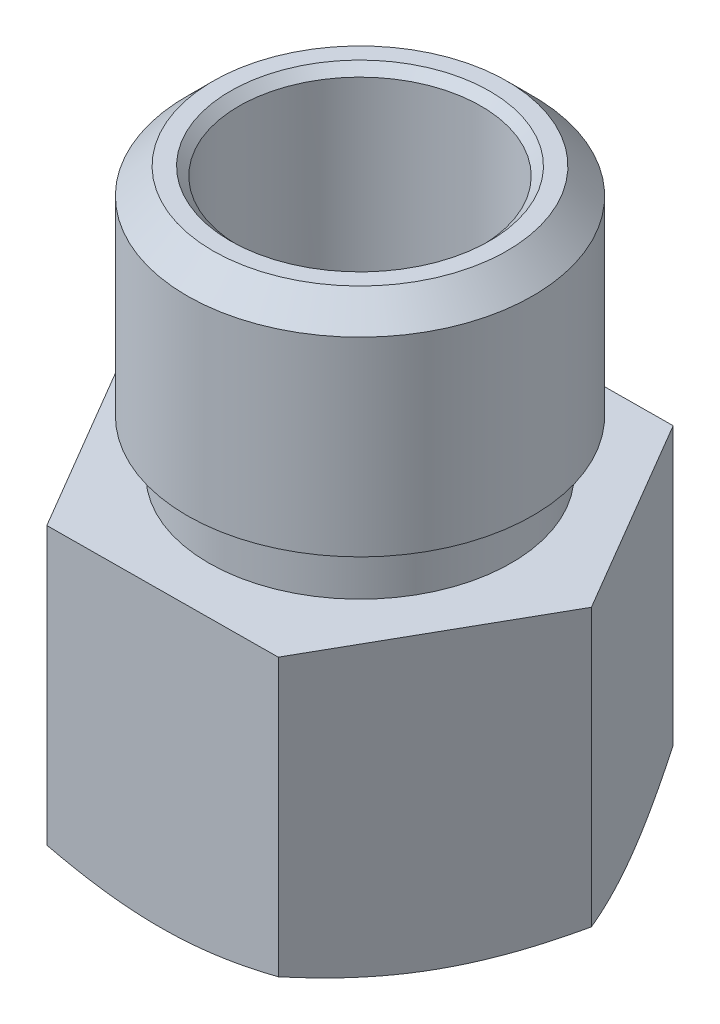
ISO-10303-21;
HEADER;
FILE_DESCRIPTION(('STEP AP214'),'2;1');
FILE_NAME('part.step','',(''),(''),'','','');
FILE_SCHEMA(('AUTOMOTIVE_DESIGN { 1 0 10303 214 1 1 1 1 }'));
ENDSEC;
DATA;
#1=APPLICATION_CONTEXT('core data for automotive mechanical design processes');
#2=APPLICATION_PROTOCOL_DEFINITION('international standard','automotive_design',2000,#1);
#3=PRODUCT_CONTEXT('',#1,'mechanical');
#4=PRODUCT('Part','Part','',(#3));
#5=PRODUCT_RELATED_PRODUCT_CATEGORY('part','',(#4));
#6=PRODUCT_DEFINITION_FORMATION('','',#4);
#7=PRODUCT_DEFINITION_CONTEXT('part definition',#1,'design');
#8=PRODUCT_DEFINITION('design','',#6,#7);
#9=PRODUCT_DEFINITION_SHAPE('','',#8);
#10=(LENGTH_UNIT() NAMED_UNIT(*) SI_UNIT(.MILLI.,.METRE.));
#11=(NAMED_UNIT(*) PLANE_ANGLE_UNIT() SI_UNIT($,.RADIAN.));
#12=(NAMED_UNIT(*) SI_UNIT($,.STERADIAN.) SOLID_ANGLE_UNIT());
#13=UNCERTAINTY_MEASURE_WITH_UNIT(LENGTH_MEASURE(1.E-05),#10,'distance_accuracy_value','');
#14=(GEOMETRIC_REPRESENTATION_CONTEXT(3) GLOBAL_UNCERTAINTY_ASSIGNED_CONTEXT((#13)) GLOBAL_UNIT_ASSIGNED_CONTEXT((#10,
#11,#12)) REPRESENTATION_CONTEXT('',''));
#15=CARTESIAN_POINT('',(0.,0.,0.));
#16=DIRECTION('',(0.,0.,1.));
#17=DIRECTION('',(1.,0.,0.));
#18=AXIS2_PLACEMENT_3D('',#15,#16,#17);
#19=CARTESIAN_POINT('',(0.,0.,0.));
#20=DIRECTION('',(0.,1.,0.));
#21=DIRECTION('',(0.,0.,1.));
#22=AXIS2_PLACEMENT_3D('',#19,#20,#21);
#23=CYLINDRICAL_SURFACE('',#22,7.);
#24=CARTESIAN_POINT('',(0.,32.,0.));
#25=DIRECTION('',(0.,1.,0.));
#26=DIRECTION('',(0.,0.,1.));
#27=AXIS2_PLACEMENT_3D('',#24,#25,#26);
#28=CIRCLE('',#27,7.);
#29=CARTESIAN_POINT('',(0.,32.,7.));
#30=VERTEX_POINT('',#29);
#31=EDGE_CURVE('E46',#30,#30,#28,.T.);
#32=ORIENTED_EDGE('',*,*,#31,.T.);
#33=EDGE_LOOP('',(#32));
#34=FACE_BOUND('',#33,.T.);
#35=CARTESIAN_POINT('',(0.,13.,0.));
#36=DIRECTION('',(0.,-1.,0.));
#37=DIRECTION('',(0.,0.,-1.));
#38=AXIS2_PLACEMENT_3D('',#35,#36,#37);
#39=CIRCLE('',#38,7.);
#40=CARTESIAN_POINT('',(0.,13.,-7.));
#41=VERTEX_POINT('',#40);
#42=EDGE_CURVE('E41',#41,#41,#39,.F.);
#43=ORIENTED_EDGE('',*,*,#42,.F.);
#44=EDGE_LOOP('',(#43));
#45=FACE_BOUND('',#44,.T.);
#46=ADVANCED_FACE('F37',(#34,#45),#23,.F.);
#47=CARTESIAN_POINT('',(13.2786844152626,17.,-0.0993656540089263));
#48=DIRECTION('',(-0.862259714880802,0.,0.506466370150751));
#49=DIRECTION('',(0.506466370150751,0.,0.862259714880802));
#50=AXIS2_PLACEMENT_3D('',#47,#48,#49);
#51=PLANE('',#50);
#52=DIRECTION('',(0.,-1.,0.));
#53=VECTOR('',#52,1.);
#54=CARTESIAN_POINT('',(13.2786844152626,17.,-0.0993656540089263));
#55=LINE('',#54,#53);
#56=CARTESIAN_POINT('',(13.2786844152626,17.,-0.0993656540089263));
#57=VERTEX_POINT('',#56);
#58=CARTESIAN_POINT('',(13.2786844152626,0.999999999999913,-0.0993656540089263));
#59=VERTEX_POINT('',#58);
#60=EDGE_CURVE('E105',#57,#59,#55,.T.);
#61=ORIENTED_EDGE('',*,*,#60,.T.);
#62=CARTESIAN_POINT('',(13.278801889467,1.00005798792879,-0.0991656540089266));
#63=CARTESIAN_POINT('',(13.0892477828478,0.906495480012444,-0.421881789888406));
#64=CARTESIAN_POINT('',(12.8989551950581,0.818485549010916,-0.745855191010019));
#65=CARTESIAN_POINT('',(12.5168543572176,0.655424160118906,-1.39638241040671));
#66=CARTESIAN_POINT('',(12.3250453794867,0.580379375303605,-1.72293746755796));
#67=CARTESIAN_POINT('',(11.9397828409977,0.445101486414631,-2.37884748680155));
#68=CARTESIAN_POINT('',(11.7463272663629,0.384890468454874,-2.70820587752167));
#69=CARTESIAN_POINT('',(11.3582872115426,0.281279927851655,-3.36884462226612));
#70=CARTESIAN_POINT('',(11.1637029318079,0.237877507605416,-3.70012463502266));
#71=CARTESIAN_POINT('',(10.7781213489979,0.170174920080449,-4.35657782767609));
#72=CARTESIAN_POINT('',(10.5871427365605,0.145463994403388,-4.68171918673529));
#73=CARTESIAN_POINT('',(10.2047880025491,0.114463177060262,-5.33267866472373));
#74=CARTESIAN_POINT('',(10.0134118618347,0.108174193966666,-5.65849681623943));
#75=CARTESIAN_POINT('',(9.6309432470842,0.114261147632678,-6.30965017634794));
#76=CARTESIAN_POINT('',(9.43985068958976,0.126616979719078,-6.63498552702868));
#77=CARTESIAN_POINT('',(9.05821021566678,0.169480274015968,-7.28472897620153));
#78=CARTESIAN_POINT('',(8.86766225419606,0.199986188699251,-7.60913715137802));
#79=CARTESIAN_POINT('',(8.49944267573429,0.275586286577359,-8.23603150695678));
#80=CARTESIAN_POINT('',(8.32171553673145,0.319641320413002,-8.53861221366305));
#81=CARTESIAN_POINT('',(7.96725959631279,0.421466529051991,-9.14207395591501));
#82=CARTESIAN_POINT('',(7.7905309034253,0.479238166525155,-9.44295480669108));
#83=CARTESIAN_POINT('',(7.43626366329683,0.607771425592251,-10.0460952864308));
#84=CARTESIAN_POINT('',(7.25873805796857,0.67867070482349,-10.3483328817698));
#85=CARTESIAN_POINT('',(6.90498939101579,0.831480584190287,-10.950590489941));
#86=CARTESIAN_POINT('',(6.72876576088822,0.913386036987412,-11.2506114706506));
#87=CARTESIAN_POINT('',(6.55317155279144,1.00005798792881,-11.5495608594584));
#88=B_SPLINE_CURVE_WITH_KNOTS('',3,(#62,#63,#64,#65,#66,#67,#68,#69,#70,#71,#72,#73,#74,#75,#76,
#77,#78,#79,#80,#81,#82,#83,#84,#85,#86,#87),.UNSPECIFIED.,.F.,.F.,(4,2,2,2,2,2,2,2,2,2,2,2,4),
(0.,1.15741546007654,2.31542487092911,3.47514817024263,4.63467145793502,5.76790726441043,
6.901198961274,8.03326950451839,9.16524353806669,10.2259639835277,11.2867975897379,
12.3594596383154,13.4316217618208),.UNSPECIFIED.);
#89=CARTESIAN_POINT('',(6.55328902699588,0.999999999999936,-11.5493608594584));
#90=VERTEX_POINT('',#89);
#91=EDGE_CURVE('E53',#59,#90,#88,.T.);
#92=ORIENTED_EDGE('',*,*,#91,.T.);
#93=DIRECTION('',(0.,-1.,0.));
#94=VECTOR('',#93,1.);
#95=CARTESIAN_POINT('',(6.55328902699589,17.,-11.5493608594584));
#96=LINE('',#95,#94);
#97=CARTESIAN_POINT('',(6.55328902699589,17.,-11.5493608594584));
#98=VERTEX_POINT('',#97);
#99=EDGE_CURVE('E104',#98,#90,#96,.T.);
#100=ORIENTED_EDGE('',*,*,#99,.F.);
#101=DIRECTION('',(-0.506466370150751,0.,-0.862259714880802));
#102=VECTOR('',#101,1.);
#103=CARTESIAN_POINT('',(13.2786844152626,17.,-0.0993656540089263));
#104=LINE('',#103,#102);
#105=EDGE_CURVE('E266',#57,#98,#104,.T.);
#106=ORIENTED_EDGE('',*,*,#105,.F.);
#107=EDGE_LOOP('',(#61,#92,#100,#106));
#108=FACE_BOUND('',#107,.T.);
#109=ADVANCED_FACE('F102',(#108),#51,.F.);
#110=CARTESIAN_POINT('',(6.55328902699589,17.,-11.5493608594584));
#111=DIRECTION('',(0.00748288527264228,0.,0.999972002822077));
#112=DIRECTION('',(0.999972002822077,0.,-0.00748288527264228));
#113=AXIS2_PLACEMENT_3D('',#110,#111,#112);
#114=PLANE('',#113);
#115=ORIENTED_EDGE('',*,*,#99,.T.);
#116=CARTESIAN_POINT('',(6.55348902699589,1.00005000196466,-11.5493623560773));
#117=CARTESIAN_POINT('',(6.17923229772127,0.906488004955447,-11.5465617575008));
#118=CARTESIAN_POINT('',(5.80351750874437,0.818478587991021,-11.5437502481253));
#119=CARTESIAN_POINT('',(5.04909540759903,0.655418223151411,-11.5381048360397));
#120=CARTESIAN_POINT('',(4.67038665870723,0.580373948311718,-11.5352709225784));
#121=CARTESIAN_POINT('',(3.90972211150778,0.445097066884958,-11.5295787976773));
#122=CARTESIAN_POINT('',(3.52776233709572,0.384886545907937,-11.5267205564839));
#123=CARTESIAN_POINT('',(2.76161388734343,0.281276966483241,-11.5209873950203));
#124=CARTESIAN_POINT('',(2.37742560777006,0.237875010449097,-11.5181124777116));
#125=CARTESIAN_POINT('',(1.61613116407676,0.170173285486741,-11.5124156392353));
#126=CARTESIAN_POINT('',(1.23906190221761,0.145462761642441,-11.5095939942109));
#127=CARTESIAN_POINT('',(0.484138552019265,0.114462686189678,-11.5039448312311));
#128=CARTESIAN_POINT('',(0.106284425889888,0.108174043157357,-11.5011173129929));
#129=CARTESIAN_POINT('',(-0.648863742889136,0.114261600739779,-11.4954664676744));
#130=CARTESIAN_POINT('',(-1.02615795033378,0.126617696996423,-11.4926431393608));
#131=CARTESIAN_POINT('',(-1.77967101273376,0.16948143639026,-11.4870045296983));
#132=CARTESIAN_POINT('',(-2.15588995662197,0.199987531999137,-11.4841892476838));
#133=CARTESIAN_POINT('',(-2.88290153838933,0.275587568352364,-11.4787489511126));
#134=CARTESIAN_POINT('',(-3.23380381381667,0.319642229755087,-11.4761231161277));
#135=CARTESIAN_POINT('',(-3.93363727744409,0.421466387743175,-11.4708861959905));
#136=CARTESIAN_POINT('',(-4.28256825138991,0.47923734682663,-11.4682751124414));
#137=CARTESIAN_POINT('',(-4.98202913527991,0.607768971979281,-11.4630409803536));
#138=CARTESIAN_POINT('',(-5.33253349355472,0.678667290738526,-11.4604181230205));
#139=CARTESIAN_POINT('',(-6.03097051886239,0.831475033525346,-11.4551916525635));
#140=CARTESIAN_POINT('',(-6.37890430827846,0.913379310541671,-11.4525880310408));
#141=CARTESIAN_POINT('',(-6.72559538826666,1.00005000196464,-11.4499937088305));
#142=B_SPLINE_CURVE_WITH_KNOTS('',3,(#116,#117,#118,#119,#120,#121,#122,#123,#124,#125,#126,
#127,#128,#129,#130,#131,#132,#133,#134,#135,#136,#137,#138,#139,#140,#141),.UNSPECIFIED.,.F.,
.F.,(4,2,2,2,2,2,2,2,2,2,2,2,4),(0.,1.15741306233225,2.31542007088461,3.47514092704066,
4.63466177273383,5.76789534332623,6.90118480460978,8.03325312886427,9.16522494310022,
10.225933731874,11.2867556693873,12.3594057431476,13.4315559193472),.UNSPECIFIED.);
#143=CARTESIAN_POINT('',(-6.72539538826666,0.999999999999913,-11.4499952054494));
#144=VERTEX_POINT('',#143);
#145=EDGE_CURVE('E90',#90,#144,#142,.T.);
#146=ORIENTED_EDGE('',*,*,#145,.T.);
#147=DIRECTION('',(0.,-1.,0.));
#148=VECTOR('',#147,1.);
#149=CARTESIAN_POINT('',(-6.72539538826666,17.,-11.4499952054494));
#150=LINE('',#149,#148);
#151=CARTESIAN_POINT('',(-6.72539538826666,17.,-11.4499952054494));
#152=VERTEX_POINT('',#151);
#153=EDGE_CURVE('E111',#152,#144,#150,.T.);
#154=ORIENTED_EDGE('',*,*,#153,.F.);
#155=DIRECTION('',(-0.999972002822077,0.,0.00748288527264229));
#156=VECTOR('',#155,1.);
#157=CARTESIAN_POINT('',(6.55328902699589,17.,-11.5493608594584));
#158=LINE('',#157,#156);
#159=EDGE_CURVE('E109',#98,#152,#158,.T.);
#160=ORIENTED_EDGE('',*,*,#159,.F.);
#161=EDGE_LOOP('',(#115,#146,#154,#160));
#162=FACE_BOUND('',#161,.T.);
#163=ADVANCED_FACE('F108',(#162),#114,.F.);
#164=CARTESIAN_POINT('',(-6.72539538826666,17.,-11.4499952054494));
#165=DIRECTION('',(0.869742600153445,0.,0.493505632671326));
#166=DIRECTION('',(0.493505632671326,0.,-0.869742600153445));
#167=AXIS2_PLACEMENT_3D('',#164,#165,#166);
#168=PLANE('',#167);
#169=ORIENTED_EDGE('',*,*,#153,.T.);
#170=CARTESIAN_POINT('',(-6.72528190512059,1.00005748901951,-11.4501952054494));
#171=CARTESIAN_POINT('',(-6.90998520223733,0.906495013021198,-11.1246785036001));
#172=CARTESIAN_POINT('',(-7.0954080822684,0.818485114133238,-10.7978936259216));
#173=CARTESIAN_POINT('',(-7.46773071755255,0.655423789217099,-10.1417210607673));
#174=CARTESIAN_POINT('',(-7.65463118186342,0.580379036261622,-9.81233212366499));
#175=CARTESIAN_POINT('',(-8.0300346068258,0.445101210312064,-9.15073004798871));
#176=CARTESIAN_POINT('',(-8.21853952981428,0.38489022340042,-8.81851345103871));
#177=CARTESIAN_POINT('',(-8.59664939141831,0.281279742845112,-8.15214161573655));
#178=CARTESIAN_POINT('',(-8.78625413471284,0.237877351599688,-7.81798672161351));
#179=CARTESIAN_POINT('',(-9.16196843863417,0.170174817961752,-7.15583676024718));
#180=CARTESIAN_POINT('',(-9.34805978694809,0.145463917388455,-6.82787378995135));
#181=CARTESIAN_POINT('',(-9.72062981965142,0.11446314639355,-6.17126521746428));
#182=CARTESIAN_POINT('',(-9.90710852269132,0.108174184544642,-5.84261958240386));
#183=CARTESIAN_POINT('',(-10.2797895209837,0.114261175939173,-5.18581544679942));
#184=CARTESIAN_POINT('',(-10.4659918975592,0.12661702452909,-4.85765680293364));
#185=CARTESIAN_POINT('',(-10.8378659470453,0.169480346632508,-4.20227481473041));
#186=CARTESIAN_POINT('',(-11.0235376638455,0.199986272618733,-3.87505139304303));
#187=CARTESIAN_POINT('',(-11.3823341688252,0.275586366653234,-3.24271695852426));
#188=CARTESIAN_POINT('',(-11.5555130586223,0.31964137722188,-2.93751059828783));
#189=CARTESIAN_POINT('',(-11.9008980498391,0.421466520223447,-2.32881229693535));
#190=CARTESIAN_POINT('',(-12.0731040455087,0.479238115315459,-2.02532054219103));
#191=CARTESIAN_POINT('',(-12.4183051651242,0.607771272306697,-1.41694629177955));
#192=CARTESIAN_POINT('',(-12.5912876783775,0.678670491534158,-1.11208602089748));
#193=CARTESIAN_POINT('',(-12.9359834959049,0.831480237421918,-0.504602302878869));
#194=CARTESIAN_POINT('',(-13.1076973541314,0.913385616764225,-0.201977879469661));
#195=CARTESIAN_POINT('',(-13.2787978984086,1.00005748901945,0.0995656540089272));
#196=B_SPLINE_CURVE_WITH_KNOTS('',3,(#170,#171,#172,#173,#174,#175,#176,#177,#178,#179,#180,
#181,#182,#183,#184,#185,#186,#187,#188,#189,#190,#191,#192,#193,#194,#195),.UNSPECIFIED.,.F.,
.F.,(4,2,2,2,2,2,2,2,2,2,2,2,4),(0.,1.15741531028125,2.31542457105391,3.47514771773503,
4.63467085286736,5.76790651965949,6.90119807685872,8.03326848147521,9.16524237637546,
10.2259620936075,11.2867949708385,12.3594562713123,13.4316176484328),.UNSPECIFIED.);
#197=CARTESIAN_POINT('',(-13.2786844152626,0.999999999999867,0.0993656540089118));
#198=VERTEX_POINT('',#197);
#199=EDGE_CURVE('E93',#144,#198,#196,.T.);
#200=ORIENTED_EDGE('',*,*,#199,.T.);
#201=DIRECTION('',(0.,-1.,0.));
#202=VECTOR('',#201,1.);
#203=CARTESIAN_POINT('',(-13.2786844152625,17.,0.0993656540089282));
#204=LINE('',#203,#202);
#205=CARTESIAN_POINT('',(-13.2786844152625,17.,0.0993656540089282));
#206=VERTEX_POINT('',#205);
#207=EDGE_CURVE('E116',#206,#198,#204,.T.);
#208=ORIENTED_EDGE('',*,*,#207,.F.);
#209=DIRECTION('',(-0.493505632671326,0.,0.869742600153444));
#210=VECTOR('',#209,1.);
#211=CARTESIAN_POINT('',(-6.72539538826666,17.,-11.4499952054494));
#212=LINE('',#211,#210);
#213=EDGE_CURVE('E263',#152,#206,#212,.T.);
#214=ORIENTED_EDGE('',*,*,#213,.F.);
#215=EDGE_LOOP('',(#169,#200,#208,#214));
#216=FACE_BOUND('',#215,.T.);
#217=ADVANCED_FACE('F195',(#216),#168,.F.);
#218=CARTESIAN_POINT('',(-13.2786844152625,17.,0.0993656540089282));
#219=DIRECTION('',(0.862259714880802,0.,-0.506466370150751));
#220=DIRECTION('',(-0.506466370150751,0.,-0.862259714880802));
#221=AXIS2_PLACEMENT_3D('',#218,#219,#220);
#222=PLANE('',#221);
#223=ORIENTED_EDGE('',*,*,#207,.T.);
#224=CARTESIAN_POINT('',(-13.278801889467,1.00005798792873,0.0991656540089284));
#225=CARTESIAN_POINT('',(-13.0892477828478,0.906495480012392,0.421881789888409));
#226=CARTESIAN_POINT('',(-12.8989551950581,0.818485549010863,0.745855191010022));
#227=CARTESIAN_POINT('',(-12.5168543572176,0.655424160118849,1.39638241040671));
#228=CARTESIAN_POINT('',(-12.3250453794867,0.580379375303546,1.72293746755796));
#229=CARTESIAN_POINT('',(-11.9397828409977,0.44510148641457,2.37884748680155));
#230=CARTESIAN_POINT('',(-11.7463272663629,0.384890468454813,2.70820587752167));
#231=CARTESIAN_POINT('',(-11.3582872115426,0.281279927851592,3.36884462226613));
#232=CARTESIAN_POINT('',(-11.1637029318079,0.237877507605351,3.70012463502267));
#233=CARTESIAN_POINT('',(-10.7781213489979,0.170174920080382,4.3565778276761));
#234=CARTESIAN_POINT('',(-10.5871427365605,0.14546399440332,4.6817191867353));
#235=CARTESIAN_POINT('',(-10.2047880025491,0.114463177060191,5.33267866472375));
#236=CARTESIAN_POINT('',(-10.0134118618347,0.108174193966594,5.65849681623944));
#237=CARTESIAN_POINT('',(-9.63094324708419,0.114261147632604,6.30965017634795));
#238=CARTESIAN_POINT('',(-9.43985068958975,0.126616979719004,6.6349855270287));
#239=CARTESIAN_POINT('',(-9.05821021566677,0.169480274015891,7.28472897620155));
#240=CARTESIAN_POINT('',(-8.86766225419604,0.199986188699173,7.60913715137804));
#241=CARTESIAN_POINT('',(-8.49944267573428,0.275586286577279,8.2360315069568));
#242=CARTESIAN_POINT('',(-8.32171553673143,0.319641320412921,8.53861221366307));
#243=CARTESIAN_POINT('',(-7.96725959631278,0.421466529051907,9.14207395591502));
#244=CARTESIAN_POINT('',(-7.79053090342528,0.47923816652507,9.44295480669109));
#245=CARTESIAN_POINT('',(-7.43626366329682,0.607771425592162,10.0460952864309));
#246=CARTESIAN_POINT('',(-7.25873805796856,0.678670704823399,10.3483328817698));
#247=CARTESIAN_POINT('',(-6.90498939101578,0.831480584190192,10.950590489941));
#248=CARTESIAN_POINT('',(-6.72876576088821,0.913386036987316,11.2506114706506));
#249=CARTESIAN_POINT('',(-6.55317155279144,1.00005798792871,11.5495608594584));
#250=B_SPLINE_CURVE_WITH_KNOTS('',3,(#224,#225,#226,#227,#228,#229,#230,#231,#232,#233,#234,
#235,#236,#237,#238,#239,#240,#241,#242,#243,#244,#245,#246,#247,#248,#249),.UNSPECIFIED.,.F.,
.F.,(4,2,2,2,2,2,2,2,2,2,2,2,4),(0.,1.15741546007654,2.31542487092912,3.47514817024264,
4.63467145793503,5.76790726441044,6.90119896127402,8.03326950451842,9.16524353806671,
10.2259639835277,11.2867975897379,12.3594596383154,13.4316217618208),.UNSPECIFIED.);
#251=CARTESIAN_POINT('',(-6.5532890269959,0.999999999999844,11.5493608594584));
#252=VERTEX_POINT('',#251);
#253=EDGE_CURVE('E175',#198,#252,#250,.T.);
#254=ORIENTED_EDGE('',*,*,#253,.T.);
#255=DIRECTION('',(0.,-1.,0.));
#256=VECTOR('',#255,1.);
#257=CARTESIAN_POINT('',(-6.55328902699588,17.,11.5493608594584));
#258=LINE('',#257,#256);
#259=CARTESIAN_POINT('',(-6.55328902699588,17.,11.5493608594584));
#260=VERTEX_POINT('',#259);
#261=EDGE_CURVE('E252',#260,#252,#258,.T.);
#262=ORIENTED_EDGE('',*,*,#261,.F.);
#263=DIRECTION('',(0.506466370150751,0.,0.862259714880802));
#264=VECTOR('',#263,1.);
#265=CARTESIAN_POINT('',(-13.2786844152625,17.,0.0993656540089282));
#266=LINE('',#265,#264);
#267=EDGE_CURVE('E250',#206,#260,#266,.T.);
#268=ORIENTED_EDGE('',*,*,#267,.F.);
#269=EDGE_LOOP('',(#223,#254,#262,#268));
#270=FACE_BOUND('',#269,.T.);
#271=ADVANCED_FACE('F235',(#270),#222,.F.);
#272=CARTESIAN_POINT('',(-6.55328902699588,17.,11.5493608594584));
#273=DIRECTION('',(-0.00748288527264255,0.,-0.999972002822077));
#274=DIRECTION('',(-0.999972002822077,0.,0.00748288527264255));
#275=AXIS2_PLACEMENT_3D('',#272,#273,#274);
#276=PLANE('',#275);
#277=ORIENTED_EDGE('',*,*,#261,.T.);
#278=CARTESIAN_POINT('',(-6.55348902699588,1.00005000196456,11.5493623560773));
#279=CARTESIAN_POINT('',(-6.17923229772126,0.906488004955348,11.5465617575008));
#280=CARTESIAN_POINT('',(-5.80351750874437,0.818478587990924,11.5437502481253));
#281=CARTESIAN_POINT('',(-5.04909540759902,0.655418223151318,11.5381048360397));
#282=CARTESIAN_POINT('',(-4.67038665870722,0.580373948311626,11.5352709225784));
#283=CARTESIAN_POINT('',(-3.90972211150776,0.44509706688487,11.5295787976773));
#284=CARTESIAN_POINT('',(-3.5277623370957,0.384886545907851,11.5267205564839));
#285=CARTESIAN_POINT('',(-2.76161388734341,0.281276966483157,11.5209873950203));
#286=CARTESIAN_POINT('',(-2.37742560777005,0.237875010449014,11.5181124777116));
#287=CARTESIAN_POINT('',(-1.61613116407674,0.170173285486662,11.5124156392353));
#288=CARTESIAN_POINT('',(-1.23906190221759,0.145462761642364,11.5095939942109));
#289=CARTESIAN_POINT('',(-0.484138552019243,0.114462686189606,11.5039448312311));
#290=CARTESIAN_POINT('',(-0.106284425889866,0.108174043157287,11.5011173129929));
#291=CARTESIAN_POINT('',(0.64886374288916,0.114261600739711,11.4954664676744));
#292=CARTESIAN_POINT('',(1.0261579503338,0.126617696996355,11.4926431393608));
#293=CARTESIAN_POINT('',(1.77967101273379,0.169481436390195,11.4870045296983));
#294=CARTESIAN_POINT('',(2.155889956622,0.199987531999075,11.4841892476838));
#295=CARTESIAN_POINT('',(2.88290153838935,0.275587568352305,11.4787489511126));
#296=CARTESIAN_POINT('',(3.23380381381669,0.319642229755029,11.4761231161277));
#297=CARTESIAN_POINT('',(3.93363727744411,0.421466387743119,11.4708861959905));
#298=CARTESIAN_POINT('',(4.28256825138993,0.479237346826575,11.4682751124414));
#299=CARTESIAN_POINT('',(4.98202913527992,0.607768971979228,11.4630409803536));
#300=CARTESIAN_POINT('',(5.33253349355473,0.678667290738473,11.4604181230205));
#301=CARTESIAN_POINT('',(6.0309705188624,0.831475033525294,11.4551916525635));
#302=CARTESIAN_POINT('',(6.37890430827846,0.91337931054162,11.4525880310408));
#303=CARTESIAN_POINT('',(6.72559538826665,1.00005000196459,11.4499937088305));
#304=B_SPLINE_CURVE_WITH_KNOTS('',3,(#278,#279,#280,#281,#282,#283,#284,#285,#286,#287,#288,
#289,#290,#291,#292,#293,#294,#295,#296,#297,#298,#299,#300,#301,#302,#303),.UNSPECIFIED.,.F.,
.F.,(4,2,2,2,2,2,2,2,2,2,2,2,4),(0.,1.15741306233225,2.31542007088462,3.47514092704067,
4.63466177273384,5.76789534332625,6.90118480460979,8.03325312886429,9.16522494310024,
10.2259337318741,11.2867556693873,12.3594057431476,13.4315559193472),.UNSPECIFIED.);
#305=CARTESIAN_POINT('',(6.72539538826665,0.999999999999867,11.4499952054494));
#306=VERTEX_POINT('',#305);
#307=EDGE_CURVE('E168',#252,#306,#304,.T.);
#308=ORIENTED_EDGE('',*,*,#307,.T.);
#309=DIRECTION('',(0.,-1.,0.));
#310=VECTOR('',#309,1.);
#311=CARTESIAN_POINT('',(6.72539538826666,17.,11.4499952054494));
#312=LINE('',#311,#310);
#313=CARTESIAN_POINT('',(6.72539538826666,17.,11.4499952054494));
#314=VERTEX_POINT('',#313);
#315=EDGE_CURVE('E253',#314,#306,#312,.T.);
#316=ORIENTED_EDGE('',*,*,#315,.F.);
#317=DIRECTION('',(0.999972002822077,0.,-0.00748288527264255));
#318=VECTOR('',#317,1.);
#319=CARTESIAN_POINT('',(-6.55328902699588,17.,11.5493608594584));
#320=LINE('',#319,#318);
#321=EDGE_CURVE('E260',#260,#314,#320,.T.);
#322=ORIENTED_EDGE('',*,*,#321,.F.);
#323=EDGE_LOOP('',(#277,#308,#316,#322));
#324=FACE_BOUND('',#323,.T.);
#325=ADVANCED_FACE('F231',(#324),#276,.F.);
#326=CARTESIAN_POINT('',(6.72539538826666,17.,11.4499952054494));
#327=DIRECTION('',(-0.869742600153444,0.,-0.493505632671326));
#328=DIRECTION('',(-0.493505632671326,0.,0.869742600153444));
#329=AXIS2_PLACEMENT_3D('',#326,#327,#328);
#330=PLANE('',#329);
#331=ORIENTED_EDGE('',*,*,#315,.T.);
#332=CARTESIAN_POINT('',(6.72528190512059,1.00005748901945,11.4501952054494));
#333=CARTESIAN_POINT('',(6.90998520223733,0.906495013021147,11.1246785036001));
#334=CARTESIAN_POINT('',(7.0954080822684,0.81848511413319,10.7978936259216));
#335=CARTESIAN_POINT('',(7.46773071755254,0.655423789217059,10.1417210607673));
#336=CARTESIAN_POINT('',(7.65463118186342,0.580379036261587,9.81233212366498));
#337=CARTESIAN_POINT('',(8.0300346068258,0.445101210312035,9.15073004798871));
#338=CARTESIAN_POINT('',(8.21853952981428,0.384890223400393,8.8185134510387));
#339=CARTESIAN_POINT('',(8.59664939141831,0.281279742845089,8.15214161573654));
#340=CARTESIAN_POINT('',(8.78625413471284,0.237877351599668,7.81798672161351));
#341=CARTESIAN_POINT('',(9.16196843863417,0.170174817961738,7.15583676024718));
#342=CARTESIAN_POINT('',(9.34805978694809,0.145463917388445,6.82787378995134));
#343=CARTESIAN_POINT('',(9.72062981965142,0.114463146393545,6.17126521746428));
#344=CARTESIAN_POINT('',(9.90710852269132,0.108174184544639,5.84261958240385));
#345=CARTESIAN_POINT('',(10.2797895209837,0.114261175939176,5.18581544679942));
#346=CARTESIAN_POINT('',(10.4659918975592,0.126617024529097,4.85765680293364));
#347=CARTESIAN_POINT('',(10.8378659470453,0.16948034663252,4.20227481473041));
#348=CARTESIAN_POINT('',(11.0235376638455,0.199986272618748,3.87505139304303));
#349=CARTESIAN_POINT('',(11.3823341688252,0.275586366653254,3.24271695852426));
#350=CARTESIAN_POINT('',(11.5555130586223,0.319641377221903,2.93751059828783));
#351=CARTESIAN_POINT('',(11.9008980498391,0.421466520223476,2.32881229693535));
#352=CARTESIAN_POINT('',(12.0731040455087,0.479238115315491,2.02532054219103));
#353=CARTESIAN_POINT('',(12.4183051651242,0.607771272306734,1.41694629177955));
#354=CARTESIAN_POINT('',(12.5912876783775,0.678670491534198,1.11208602089749));
#355=CARTESIAN_POINT('',(12.9359834959049,0.831480237421963,0.50460230287887));
#356=CARTESIAN_POINT('',(13.1076973541314,0.913385616764273,0.201977879469662));
#357=CARTESIAN_POINT('',(13.2787978984086,1.00005748901951,-0.0995656540089255));
#358=B_SPLINE_CURVE_WITH_KNOTS('',3,(#332,#333,#334,#335,#336,#337,#338,#339,#340,#341,#342,
#343,#344,#345,#346,#347,#348,#349,#350,#351,#352,#353,#354,#355,#356,#357),.UNSPECIFIED.,.F.,
.F.,(4,2,2,2,2,2,2,2,2,2,2,2,4),(0.,1.15741531028125,2.31542457105391,3.47514771773502,
4.63467085286735,5.76790651965948,6.90119807685872,8.03326848147521,9.16524237637545,
10.2259620936075,11.2867949708385,12.3594562713123,13.4316176484328),.UNSPECIFIED.);
#359=EDGE_CURVE('E159',#306,#59,#358,.T.);
#360=ORIENTED_EDGE('',*,*,#359,.T.);
#361=ORIENTED_EDGE('',*,*,#60,.F.);
#362=DIRECTION('',(0.493505632671326,0.,-0.869742600153444));
#363=VECTOR('',#362,1.);
#364=CARTESIAN_POINT('',(6.72539538826666,17.,11.4499952054494));
#365=LINE('',#364,#363);
#366=EDGE_CURVE('E61',#314,#57,#365,.T.);
#367=ORIENTED_EDGE('',*,*,#366,.F.);
#368=EDGE_LOOP('',(#331,#360,#361,#367));
#369=FACE_BOUND('',#368,.T.);
#370=ADVANCED_FACE('F227',(#369),#330,.F.);
#371=CARTESIAN_POINT('',(0.,17.,0.));
#372=DIRECTION('',(0.,1.,0.));
#373=DIRECTION('',(0.,0.,1.));
#374=AXIS2_PLACEMENT_3D('',#371,#372,#373);
#375=PLANE('',#374);
#376=CARTESIAN_POINT('',(0.,17.,0.));
#377=DIRECTION('',(0.,1.,0.));
#378=DIRECTION('',(0.,0.,1.));
#379=AXIS2_PLACEMENT_3D('',#376,#377,#378);
#380=CIRCLE('',#379,8.75);
#381=CARTESIAN_POINT('',(0.,17.,8.75));
#382=VERTEX_POINT('',#381);
#383=EDGE_CURVE('E269',#382,#382,#380,.T.);
#384=ORIENTED_EDGE('',*,*,#383,.F.);
#385=EDGE_LOOP('',(#384));
#386=FACE_BOUND('',#385,.T.);
#387=ORIENTED_EDGE('',*,*,#105,.T.);
#388=ORIENTED_EDGE('',*,*,#159,.T.);
#389=ORIENTED_EDGE('',*,*,#213,.T.);
#390=ORIENTED_EDGE('',*,*,#267,.T.);
#391=ORIENTED_EDGE('',*,*,#321,.T.);
#392=ORIENTED_EDGE('',*,*,#366,.T.);
#393=EDGE_LOOP('',(#387,#388,#389,#390,#391,#392));
#394=FACE_BOUND('',#393,.T.);
#395=ADVANCED_FACE('F221',(#386,#394),#375,.T.);
#396=CARTESIAN_POINT('',(0.,20.,0.));
#397=DIRECTION('',(0.,-1.,0.));
#398=DIRECTION('',(0.,0.,-1.));
#399=AXIS2_PLACEMENT_3D('',#396,#397,#398);
#400=CYLINDRICAL_SURFACE('',#399,8.75);
#401=CARTESIAN_POINT('',(0.,20.,0.));
#402=DIRECTION('',(0.,1.,0.));
#403=DIRECTION('',(0.,0.,1.));
#404=AXIS2_PLACEMENT_3D('',#401,#402,#403);
#405=CIRCLE('',#404,8.75);
#406=CARTESIAN_POINT('',(0.,20.,8.75));
#407=VERTEX_POINT('',#406);
#408=EDGE_CURVE('E268',#407,#407,#405,.T.);
#409=ORIENTED_EDGE('',*,*,#408,.F.);
#410=EDGE_LOOP('',(#409));
#411=FACE_BOUND('',#410,.T.);
#412=ORIENTED_EDGE('',*,*,#383,.T.);
#413=EDGE_LOOP('',(#412));
#414=FACE_BOUND('',#413,.T.);
#415=ADVANCED_FACE('F215',(#411,#414),#400,.T.);
#416=CARTESIAN_POINT('',(0.,32.5,0.));
#417=DIRECTION('',(0.,-1.,0.));
#418=DIRECTION('',(0.,0.,-1.));
#419=AXIS2_PLACEMENT_3D('',#416,#417,#418);
#420=CYLINDRICAL_SURFACE('',#419,10.);
#421=CARTESIAN_POINT('',(0.,31.,0.));
#422=DIRECTION('',(0.,1.,0.));
#423=DIRECTION('',(0.,0.,1.));
#424=AXIS2_PLACEMENT_3D('',#421,#422,#423);
#425=CIRCLE('',#424,10.);
#426=CARTESIAN_POINT('',(0.,31.,10.));
#427=VERTEX_POINT('',#426);
#428=EDGE_CURVE('E114',#427,#427,#425,.F.);
#429=ORIENTED_EDGE('',*,*,#428,.T.);
#430=EDGE_LOOP('',(#429));
#431=FACE_BOUND('',#430,.T.);
#432=CARTESIAN_POINT('',(0.,20.,0.));
#433=DIRECTION('',(0.,1.,0.));
#434=DIRECTION('',(0.,0.,1.));
#435=AXIS2_PLACEMENT_3D('',#432,#433,#434);
#436=CIRCLE('',#435,10.);
#437=CARTESIAN_POINT('',(0.,20.,10.));
#438=VERTEX_POINT('',#437);
#439=EDGE_CURVE('E106',#438,#438,#436,.T.);
#440=ORIENTED_EDGE('',*,*,#439,.T.);
#441=EDGE_LOOP('',(#440));
#442=FACE_BOUND('',#441,.T.);
#443=ADVANCED_FACE('F210',(#431,#442),#420,.T.);
#444=CARTESIAN_POINT('',(0.,32.5,0.));
#445=DIRECTION('',(0.,1.,0.));
#446=DIRECTION('',(0.,0.,1.));
#447=AXIS2_PLACEMENT_3D('',#444,#445,#446);
#448=PLANE('',#447);
#449=CARTESIAN_POINT('',(0.,32.5,0.));
#450=DIRECTION('',(0.,1.,0.));
#451=DIRECTION('',(0.,0.,1.));
#452=AXIS2_PLACEMENT_3D('',#449,#450,#451);
#453=CIRCLE('',#452,7.50000000000001);
#454=CARTESIAN_POINT('',(0.,32.5,7.50000000000001));
#455=VERTEX_POINT('',#454);
#456=EDGE_CURVE('E11',#455,#455,#453,.F.);
#457=ORIENTED_EDGE('',*,*,#456,.T.);
#458=EDGE_LOOP('',(#457));
#459=FACE_BOUND('',#458,.T.);
#460=CARTESIAN_POINT('',(0.,32.5,0.));
#461=DIRECTION('',(0.,1.,0.));
#462=DIRECTION('',(0.,0.,1.));
#463=AXIS2_PLACEMENT_3D('',#460,#461,#462);
#464=CIRCLE('',#463,8.50000000000001);
#465=CARTESIAN_POINT('',(0.,32.5,8.50000000000001));
#466=VERTEX_POINT('',#465);
#467=EDGE_CURVE('E110',#466,#466,#464,.T.);
#468=ORIENTED_EDGE('',*,*,#467,.T.);
#469=EDGE_LOOP('',(#468));
#470=FACE_BOUND('',#469,.T.);
#471=ADVANCED_FACE('F154',(#459,#470),#448,.T.);
#472=CARTESIAN_POINT('',(0.,20.,0.));
#473=DIRECTION('',(0.,1.,0.));
#474=DIRECTION('',(0.,0.,1.));
#475=AXIS2_PLACEMENT_3D('',#472,#473,#474);
#476=PLANE('',#475);
#477=ORIENTED_EDGE('',*,*,#408,.T.);
#478=EDGE_LOOP('',(#477));
#479=FACE_BOUND('',#478,.T.);
#480=ORIENTED_EDGE('',*,*,#439,.F.);
#481=EDGE_LOOP('',(#480));
#482=FACE_BOUND('',#481,.T.);
#483=ADVANCED_FACE('F199',(#479,#482),#476,.F.);
#484=CARTESIAN_POINT('',(0.,32.5,0.));
#485=DIRECTION('',(0.,-1.,0.));
#486=DIRECTION('',(0.,0.,-1.));
#487=AXIS2_PLACEMENT_3D('',#484,#485,#486);
#488=CONICAL_SURFACE('',#487,8.50000000000001,0.785398163397446);
#489=ORIENTED_EDGE('',*,*,#428,.F.);
#490=EDGE_LOOP('',(#489));
#491=FACE_BOUND('',#490,.T.);
#492=ORIENTED_EDGE('',*,*,#467,.F.);
#493=EDGE_LOOP('',(#492));
#494=FACE_BOUND('',#493,.T.);
#495=ADVANCED_FACE('F152',(#491,#494),#488,.T.);
#496=CARTESIAN_POINT('',(0.,0.99999999999989,0.));
#497=DIRECTION('',(0.,1.,0.));
#498=DIRECTION('',(0.,0.,1.));
#499=AXIS2_PLACEMENT_3D('',#496,#497,#498);
#500=CONICAL_SURFACE('',#499,13.2790561913614,1.10714871779413);
#501=CARTESIAN_POINT('',(0.,0.,0.));
#502=DIRECTION('',(0.,-1.,0.));
#503=DIRECTION('',(0.,0.,-1.));
#504=AXIS2_PLACEMENT_3D('',#501,#502,#503);
#505=CIRCLE('',#504,11.2790561913614);
#506=CARTESIAN_POINT('',(0.,0.,-11.2790561913614));
#507=VERTEX_POINT('',#506);
#508=EDGE_CURVE('E281',#507,#507,#505,.T.);
#509=ORIENTED_EDGE('',*,*,#508,.F.);
#510=EDGE_LOOP('',(#509));
#511=FACE_BOUND('',#510,.T.);
#512=ORIENTED_EDGE('',*,*,#359,.F.);
#513=ORIENTED_EDGE('',*,*,#307,.F.);
#514=ORIENTED_EDGE('',*,*,#253,.F.);
#515=ORIENTED_EDGE('',*,*,#199,.F.);
#516=ORIENTED_EDGE('',*,*,#145,.F.);
#517=ORIENTED_EDGE('',*,*,#91,.F.);
#518=EDGE_LOOP('',(#512,#513,#514,#515,#516,#517));
#519=FACE_BOUND('',#518,.T.);
#520=ADVANCED_FACE('F91',(#511,#519),#500,.T.);
#521=CARTESIAN_POINT('',(0.,0.,0.));
#522=DIRECTION('',(0.,1.,0.));
#523=DIRECTION('',(0.,0.,1.));
#524=AXIS2_PLACEMENT_3D('',#521,#522,#523);
#525=PLANE('',#524);
#526=CARTESIAN_POINT('',(0.,0.,0.));
#527=DIRECTION('',(0.,-1.,0.));
#528=DIRECTION('',(0.,0.,-1.));
#529=AXIS2_PLACEMENT_3D('',#526,#527,#528);
#530=CIRCLE('',#529,9.5);
#531=CARTESIAN_POINT('',(0.,0.,-9.5));
#532=VERTEX_POINT('',#531);
#533=EDGE_CURVE('E288',#532,#532,#530,.T.);
#534=ORIENTED_EDGE('',*,*,#533,.F.);
#535=EDGE_LOOP('',(#534));
#536=FACE_BOUND('',#535,.T.);
#537=ORIENTED_EDGE('',*,*,#508,.T.);
#538=EDGE_LOOP('',(#537));
#539=FACE_BOUND('',#538,.T.);
#540=ADVANCED_FACE('F129',(#536,#539),#525,.F.);
#541=CARTESIAN_POINT('',(0.,32.,0.));
#542=DIRECTION('',(0.,1.,0.));
#543=DIRECTION('',(0.,0.,1.));
#544=AXIS2_PLACEMENT_3D('',#541,#542,#543);
#545=CONICAL_SURFACE('',#544,7.,0.785398163397447);
#546=ORIENTED_EDGE('',*,*,#456,.F.);
#547=EDGE_LOOP('',(#546));
#548=FACE_BOUND('',#547,.T.);
#549=ORIENTED_EDGE('',*,*,#31,.F.);
#550=EDGE_LOOP('',(#549));
#551=FACE_BOUND('',#550,.T.);
#552=ADVANCED_FACE('F39',(#548,#551),#545,.F.);
#553=CARTESIAN_POINT('',(0.,13.,0.));
#554=DIRECTION('',(0.,-1.,0.));
#555=DIRECTION('',(0.,0.,-1.));
#556=AXIS2_PLACEMENT_3D('',#553,#554,#555);
#557=PLANE('',#556);
#558=CARTESIAN_POINT('',(0.,13.,0.));
#559=DIRECTION('',(0.,-1.,0.));
#560=DIRECTION('',(0.,0.,-1.));
#561=AXIS2_PLACEMENT_3D('',#558,#559,#560);
#562=CIRCLE('',#561,9.5);
#563=CARTESIAN_POINT('',(0.,13.,-9.5));
#564=VERTEX_POINT('',#563);
#565=EDGE_CURVE('E286',#564,#564,#562,.T.);
#566=ORIENTED_EDGE('',*,*,#565,.T.);
#567=EDGE_LOOP('',(#566));
#568=FACE_BOUND('',#567,.T.);
#569=ORIENTED_EDGE('',*,*,#42,.T.);
#570=EDGE_LOOP('',(#569));
#571=FACE_BOUND('',#570,.T.);
#572=ADVANCED_FACE('F128',(#568,#571),#557,.T.);
#573=CARTESIAN_POINT('',(0.,13.,0.));
#574=DIRECTION('',(0.,-1.,0.));
#575=DIRECTION('',(0.,0.,-1.));
#576=AXIS2_PLACEMENT_3D('',#573,#574,#575);
#577=CYLINDRICAL_SURFACE('',#576,9.5);
#578=CARTESIAN_POINT('',(0.,13.,-9.5));
#579=CARTESIAN_POINT('',(0.,12.8645833333333,-9.5));
#580=CARTESIAN_POINT('',(0.,12.7291666666667,-9.5));
#581=CARTESIAN_POINT('',(0.,12.4583333333333,-9.5));
#582=CARTESIAN_POINT('',(0.,12.3229166666667,-9.5));
#583=CARTESIAN_POINT('',(0.,12.0520833333333,-9.5));
#584=CARTESIAN_POINT('',(0.,11.9166666666667,-9.5));
#585=CARTESIAN_POINT('',(0.,11.6458333333333,-9.5));
#586=CARTESIAN_POINT('',(0.,11.5104166666667,-9.5));
#587=CARTESIAN_POINT('',(0.,11.2395833333333,-9.5));
#588=CARTESIAN_POINT('',(0.,11.1041666666667,-9.5));
#589=CARTESIAN_POINT('',(0.,10.8333333333333,-9.5));
#590=CARTESIAN_POINT('',(0.,10.6979166666667,-9.5));
#591=CARTESIAN_POINT('',(0.,10.4270833333333,-9.5));
#592=CARTESIAN_POINT('',(0.,10.2916666666667,-9.5));
#593=CARTESIAN_POINT('',(0.,10.0208333333333,-9.5));
#594=CARTESIAN_POINT('',(0.,9.88541666666667,-9.5));
#595=CARTESIAN_POINT('',(0.,9.61458333333333,-9.5));
#596=CARTESIAN_POINT('',(0.,9.47916666666667,-9.5));
#597=CARTESIAN_POINT('',(0.,9.20833333333333,-9.5));
#598=CARTESIAN_POINT('',(0.,9.07291666666667,-9.5));
#599=CARTESIAN_POINT('',(0.,8.80208333333333,-9.5));
#600=CARTESIAN_POINT('',(0.,8.66666666666667,-9.5));
#601=CARTESIAN_POINT('',(0.,8.39583333333333,-9.5));
#602=CARTESIAN_POINT('',(0.,8.26041666666667,-9.5));
#603=CARTESIAN_POINT('',(0.,7.98958333333333,-9.5));
#604=CARTESIAN_POINT('',(0.,7.85416666666667,-9.5));
#605=CARTESIAN_POINT('',(0.,7.58333333333333,-9.5));
#606=CARTESIAN_POINT('',(0.,7.44791666666667,-9.5));
#607=CARTESIAN_POINT('',(0.,7.17708333333333,-9.5));
#608=CARTESIAN_POINT('',(0.,7.04166666666667,-9.5));
#609=CARTESIAN_POINT('',(0.,6.77083333333333,-9.5));
#610=CARTESIAN_POINT('',(0.,6.63541666666667,-9.5));
#611=CARTESIAN_POINT('',(0.,6.36458333333333,-9.5));
#612=CARTESIAN_POINT('',(0.,6.22916666666667,-9.5));
#613=CARTESIAN_POINT('',(0.,5.95833333333333,-9.5));
#614=CARTESIAN_POINT('',(0.,5.82291666666667,-9.5));
#615=CARTESIAN_POINT('',(0.,5.55208333333333,-9.5));
#616=CARTESIAN_POINT('',(0.,5.41666666666667,-9.5));
#617=CARTESIAN_POINT('',(0.,5.14583333333333,-9.5));
#618=CARTESIAN_POINT('',(0.,5.01041666666667,-9.5));
#619=CARTESIAN_POINT('',(0.,4.73958333333333,-9.5));
#620=CARTESIAN_POINT('',(0.,4.60416666666667,-9.5));
#621=CARTESIAN_POINT('',(0.,4.33333333333333,-9.5));
#622=CARTESIAN_POINT('',(0.,4.19791666666667,-9.5));
#623=CARTESIAN_POINT('',(0.,3.92708333333333,-9.5));
#624=CARTESIAN_POINT('',(0.,3.79166666666667,-9.5));
#625=CARTESIAN_POINT('',(0.,3.52083333333333,-9.5));
#626=CARTESIAN_POINT('',(0.,3.38541666666667,-9.5));
#627=CARTESIAN_POINT('',(0.,3.11458333333333,-9.5));
#628=CARTESIAN_POINT('',(0.,2.97916666666667,-9.5));
#629=CARTESIAN_POINT('',(0.,2.70833333333333,-9.5));
#630=CARTESIAN_POINT('',(0.,2.57291666666667,-9.5));
#631=CARTESIAN_POINT('',(0.,2.30208333333333,-9.5));
#632=CARTESIAN_POINT('',(0.,2.16666666666667,-9.5));
#633=CARTESIAN_POINT('',(0.,1.89583333333333,-9.5));
#634=CARTESIAN_POINT('',(0.,1.76041666666667,-9.5));
#635=CARTESIAN_POINT('',(0.,1.48958333333333,-9.5));
#636=CARTESIAN_POINT('',(0.,1.35416666666667,-9.5));
#637=CARTESIAN_POINT('',(0.,1.08333333333333,-9.5));
#638=CARTESIAN_POINT('',(0.,0.947916666666667,-9.5));
#639=CARTESIAN_POINT('',(0.,0.677083333333334,-9.5));
#640=CARTESIAN_POINT('',(0.,0.541666666666667,-9.5));
#641=CARTESIAN_POINT('',(0.,0.270833333333334,-9.5));
#642=CARTESIAN_POINT('',(0.,0.135416666666667,-9.5));
#643=CARTESIAN_POINT('',(0.,0.,-9.5));
#644=B_SPLINE_CURVE_WITH_KNOTS('',3,(#578,#579,#580,#581,#582,#583,#584,#585,#586,#587,#588,
#589,#590,#591,#592,#593,#594,#595,#596,#597,#598,#599,#600,#601,#602,#603,#604,#605,#606,#607,
#608,#609,#610,#611,#612,#613,#614,#615,#616,#617,#618,#619,#620,#621,#622,#623,#624,#625,#626,
#627,#628,#629,#630,#631,#632,#633,#634,#635,#636,#637,#638,#639,#640,#641,#642,#643),
.UNSPECIFIED.,.F.,.F.,(4,2,2,2,2,2,2,2,2,2,2,2,2,2,2,2,2,2,2,2,2,2,2,2,2,2,2,2,2,2,2,2,4),(0.,
0.406249999999999,0.812499999999999,1.21875,1.625,2.03125,2.4375,2.84375,3.25,3.65625,4.0625,
4.46875,4.875,5.28125,5.6875,6.09375,6.5,6.90625,7.3125,7.71875,8.125,8.53125,8.9375,9.34375,
9.75,10.15625,10.5625,10.96875,11.375,11.78125,12.1875,12.59375,13.),.UNSPECIFIED.);
#645=EDGE_CURVE('BSEAM135',#564,#532,#644,.T.);
#646=ORIENTED_EDGE('',*,*,#565,.F.);
#647=ORIENTED_EDGE('',*,*,#533,.T.);
#648=ORIENTED_EDGE('',*,*,#645,.T.);
#649=ORIENTED_EDGE('',*,*,#645,.F.);
#650=EDGE_LOOP('',(#646,#648,#647,#649));
#651=FACE_BOUND('',#650,.T.);
#652=ADVANCED_FACE('F135',(#651),#577,.F.);
#653=CLOSED_SHELL('',(#46,#109,#163,#217,#271,#325,#370,#395,#415,#443,#471,#483,#495,#520,#540,
#552,#572,#652));
#654=MANIFOLD_SOLID_BREP('B2',#653);
#655=ADVANCED_BREP_SHAPE_REPRESENTATION('',(#18,#654),#14);
#656=SHAPE_DEFINITION_REPRESENTATION(#9,#655);
ENDSEC;
END-ISO-10303-21;
